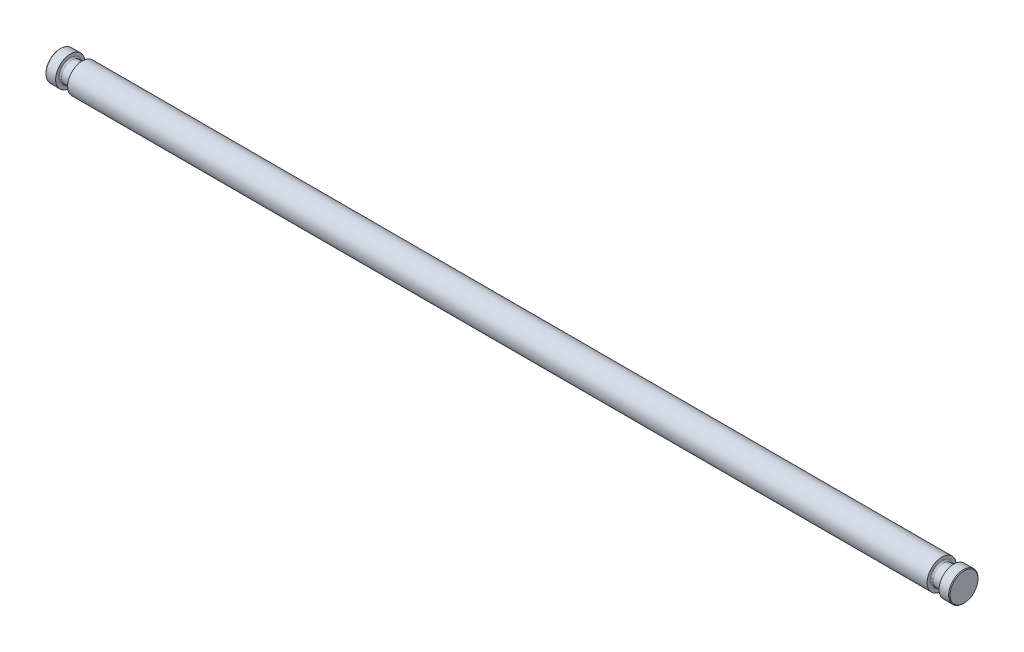
ISO-10303-21;
HEADER;
FILE_DESCRIPTION(('STEP AP214'),'2;1');
FILE_NAME('part.step','',(''),(''),'','','');
FILE_SCHEMA(('AUTOMOTIVE_DESIGN { 1 0 10303 214 1 1 1 1 }'));
ENDSEC;
DATA;
#1=APPLICATION_CONTEXT('core data for automotive mechanical design processes');
#2=APPLICATION_PROTOCOL_DEFINITION('international standard','automotive_design',2000,#1);
#3=PRODUCT_CONTEXT('',#1,'mechanical');
#4=PRODUCT('Part','Part','',(#3));
#5=PRODUCT_RELATED_PRODUCT_CATEGORY('part','',(#4));
#6=PRODUCT_DEFINITION_FORMATION('','',#4);
#7=PRODUCT_DEFINITION_CONTEXT('part definition',#1,'design');
#8=PRODUCT_DEFINITION('design','',#6,#7);
#9=PRODUCT_DEFINITION_SHAPE('','',#8);
#10=(LENGTH_UNIT() NAMED_UNIT(*) SI_UNIT(.MILLI.,.METRE.));
#11=(NAMED_UNIT(*) PLANE_ANGLE_UNIT() SI_UNIT($,.RADIAN.));
#12=(NAMED_UNIT(*) SI_UNIT($,.STERADIAN.) SOLID_ANGLE_UNIT());
#13=UNCERTAINTY_MEASURE_WITH_UNIT(LENGTH_MEASURE(1.E-05),#10,'distance_accuracy_value','');
#14=(GEOMETRIC_REPRESENTATION_CONTEXT(3) GLOBAL_UNCERTAINTY_ASSIGNED_CONTEXT((#13)) GLOBAL_UNIT_ASSIGNED_CONTEXT((#10,
#11,#12)) REPRESENTATION_CONTEXT('',''));
#15=CARTESIAN_POINT('',(0.,0.,0.));
#16=DIRECTION('',(0.,0.,1.));
#17=DIRECTION('',(1.,0.,0.));
#18=AXIS2_PLACEMENT_3D('',#15,#16,#17);
#19=CARTESIAN_POINT('',(-976.376,0.,0.));
#20=DIRECTION('',(1.,0.,0.));
#21=DIRECTION('',(0.,0.,-1.));
#22=AXIS2_PLACEMENT_3D('',#19,#20,#21);
#23=PLANE('',#22);
#24=CARTESIAN_POINT('',(-976.376,0.,0.));
#25=DIRECTION('',(1.,0.,0.));
#26=DIRECTION('',(0.,0.,-1.));
#27=AXIS2_PLACEMENT_3D('',#24,#25,#26);
#28=CIRCLE('',#27,30.20695);
#29=CARTESIAN_POINT('',(-976.376,0.,-30.20695));
#30=VERTEX_POINT('',#29);
#31=EDGE_CURVE('E56',#30,#30,#28,.F.);
#32=ORIENTED_EDGE('',*,*,#31,.T.);
#33=EDGE_LOOP('',(#32));
#34=FACE_BOUND('',#33,.T.);
#35=ADVANCED_FACE('F47',(#34),#23,.F.);
#36=CARTESIAN_POINT('',(-1001.776,0.,0.));
#37=DIRECTION('',(-1.,0.,0.));
#38=DIRECTION('',(0.,0.,1.));
#39=AXIS2_PLACEMENT_3D('',#36,#37,#38);
#40=CYLINDRICAL_SURFACE('',#39,31.73095);
#41=CARTESIAN_POINT('',(-974.852,0.,0.));
#42=DIRECTION('',(1.,0.,0.));
#43=DIRECTION('',(0.,0.,-1.));
#44=AXIS2_PLACEMENT_3D('',#41,#42,#43);
#45=CIRCLE('',#44,31.73095);
#46=CARTESIAN_POINT('',(-974.852,0.,-31.73095));
#47=VERTEX_POINT('',#46);
#48=EDGE_CURVE('E11',#47,#47,#45,.T.);
#49=ORIENTED_EDGE('',*,*,#48,.T.);
#50=EDGE_LOOP('',(#49));
#51=FACE_BOUND('',#50,.T.);
#52=CARTESIAN_POINT('',(-954.024,0.,0.));
#53=DIRECTION('',(-1.,0.,0.));
#54=DIRECTION('',(0.,0.,1.));
#55=AXIS2_PLACEMENT_3D('',#52,#53,#54);
#56=CIRCLE('',#55,31.73095);
#57=CARTESIAN_POINT('',(-954.024,0.,31.73095));
#58=VERTEX_POINT('',#57);
#59=EDGE_CURVE('E165',#58,#58,#56,.T.);
#60=ORIENTED_EDGE('',*,*,#59,.T.);
#61=EDGE_LOOP('',(#60));
#62=FACE_BOUND('',#61,.T.);
#63=ADVANCED_FACE('F272',(#51,#62),#40,.T.);
#64=CARTESIAN_POINT('',(-954.024,0.,-31.73095));
#65=DIRECTION('',(-1.,0.,0.));
#66=DIRECTION('',(0.,0.,1.));
#67=AXIS2_PLACEMENT_3D('',#64,#65,#66);
#68=PLANE('',#67);
#69=CARTESIAN_POINT('',(-954.024,0.,0.));
#70=DIRECTION('',(-1.,0.,0.));
#71=DIRECTION('',(0.,0.,1.));
#72=AXIS2_PLACEMENT_3D('',#69,#70,#71);
#73=CIRCLE('',#72,25.1968);
#74=CARTESIAN_POINT('',(-954.024,0.,25.1968));
#75=VERTEX_POINT('',#74);
#76=EDGE_CURVE('E286',#75,#75,#73,.T.);
#77=ORIENTED_EDGE('',*,*,#76,.T.);
#78=EDGE_LOOP('',(#77));
#79=FACE_BOUND('',#78,.T.);
#80=ORIENTED_EDGE('',*,*,#59,.F.);
#81=EDGE_LOOP('',(#80));
#82=FACE_BOUND('',#81,.T.);
#83=ADVANCED_FACE('F277',(#79,#82),#68,.F.);
#84=CARTESIAN_POINT('',(-1001.776,0.,0.));
#85=DIRECTION('',(-1.,0.,0.));
#86=DIRECTION('',(0.,0.,1.));
#87=AXIS2_PLACEMENT_3D('',#84,#85,#86);
#88=CYLINDRICAL_SURFACE('',#87,22.0218);
#89=CARTESIAN_POINT('',(-931.3926,0.,0.));
#90=DIRECTION('',(1.,0.,0.));
#91=DIRECTION('',(0.,0.,-1.));
#92=AXIS2_PLACEMENT_3D('',#89,#90,#91);
#93=CIRCLE('',#92,22.0218);
#94=CARTESIAN_POINT('',(-931.3926,-4.73984055331991,-21.5056640625));
#95=VERTEX_POINT('',#94);
#96=CARTESIAN_POINT('',(-931.3926,4.73984055331991,-21.5056640625));
#97=VERTEX_POINT('',#96);
#98=EDGE_CURVE('E330',#95,#97,#93,.F.);
#99=ORIENTED_EDGE('',*,*,#98,.T.);
#100=CARTESIAN_POINT('',(-931.302168545165,7.0934113504588,-20.8480980104465));
#101=CARTESIAN_POINT('',(-927.325479582766,6.79762705313636,-20.9487364327555));
#102=CARTESIAN_POINT('',(-928.2176,8.11610618183982,-24.60625));
#103=CARTESIAN_POINT('',(-931.326015362405,6.84109456346153,-20.9339576614));
#104=CARTESIAN_POINT('',(-927.461669079575,6.60732607007663,-21.009743123732));
#105=CARTESIAN_POINT('',(-928.2176,7.82741154201371,-24.60625));
#106=CARTESIAN_POINT('',(-931.343871664976,6.58690615530817,-21.0153222855975));
#107=CARTESIAN_POINT('',(-927.584403184445,6.39979844165955,-21.0735708201359));
#108=CARTESIAN_POINT('',(-928.2176,7.53657543950401,-24.60625));
#109=CARTESIAN_POINT('',(-931.370400435449,6.07550320461208,-21.1688227250801));
#110=CARTESIAN_POINT('',(-927.801875131533,5.96518510588239,-21.1999148046582));
#111=CARTESIAN_POINT('',(-928.2176,6.9514408062244,-24.60625));
#112=CARTESIAN_POINT('',(-931.379076866786,5.81829001656714,-21.2409625113773));
#113=CARTESIAN_POINT('',(-927.897904115642,5.7377728455278,-21.2627348707741));
#114=CARTESIAN_POINT('',(-928.2176,6.65714382523742,-24.60625));
#115=CARTESIAN_POINT('',(-931.390054482062,5.3015410671208,-21.3757954319522));
#116=CARTESIAN_POINT('',(-928.067262479518,5.26947819522838,-21.3834170114611));
#117=CARTESIAN_POINT('',(-928.2176,6.06589243209326,-24.60625));
#118=CARTESIAN_POINT('',(-931.392360728298,5.04200731449822,-21.4384960299311));
#119=CARTESIAN_POINT('',(-928.141484808813,5.02804627651098,-21.4416329448054));
#120=CARTESIAN_POINT('',(-928.2176,5.76894031833128,-24.60625));
#121=CARTESIAN_POINT('',(-931.392804349193,4.52080409437932,-21.5544259330734));
#122=CARTESIAN_POINT('',(-928.271759109345,4.53532481459367,-21.5511651693134));
#123=CARTESIAN_POINT('',(-928.2176,5.17259245860819,-24.60625));
#124=CARTESIAN_POINT('',(-931.390941247477,4.25913438623955,-21.6076541552057));
#125=CARTESIAN_POINT('',(-928.328406199143,4.28335185145398,-21.6028147194452));
#126=CARTESIAN_POINT('',(-928.2176,4.87319643730879,-24.60625));
#127=CARTESIAN_POINT('',(-931.384985322473,3.73976451533267,-21.7035031921574));
#128=CARTESIAN_POINT('',(-928.425868770875,3.77782883007086,-21.6968347552189));
#129=CARTESIAN_POINT('',(-928.2176,4.27894625053387,-24.60625));
#130=CARTESIAN_POINT('',(-931.380941848489,3.48210170967608,-21.7463294355167));
#131=CARTESIAN_POINT('',(-928.467368075008,3.52381374961252,-21.7396442147542));
#132=CARTESIAN_POINT('',(-928.2176,3.98413482814237,-24.60625));
#133=CARTESIAN_POINT('',(-931.372104926311,2.96542533269023,-21.8227891692697));
#134=CARTESIAN_POINT('',(-928.538718294937,3.0109955143445,-21.8165516345209));
#135=CARTESIAN_POINT('',(-928.2176,3.39296647062047,-24.60625));
#136=CARTESIAN_POINT('',(-931.367311476159,2.70641175783558,-21.8564226356588));
#137=CARTESIAN_POINT('',(-928.568823831129,2.75146036628461,-21.8508763558737));
#138=CARTESIAN_POINT('',(-928.2176,3.09660953145639,-24.60625));
#139=CARTESIAN_POINT('',(-931.358137204876,2.1873116520597,-21.9144600621862));
#140=CARTESIAN_POINT('',(-928.619262612525,2.22916840751457,-21.910285323166));
#141=CARTESIAN_POINT('',(-928.2176,2.50266800327961,-24.60625));
#142=CARTESIAN_POINT('',(-931.35375643851,1.92722498350097,-21.9388627986577));
#143=CARTESIAN_POINT('',(-928.639760282131,1.96565894501397,-21.9355425849691));
#144=CARTESIAN_POINT('',(-928.2176,2.20508325678549,-24.60625));
#145=CARTESIAN_POINT('',(-931.346271469181,1.40635472874093,-21.9783997214769));
#146=CARTESIAN_POINT('',(-928.672307288843,1.43684796553149,-21.9764854501547));
#147=CARTESIAN_POINT('',(-928.2176,1.6091163678327,-24.60625));
#148=CARTESIAN_POINT('',(-931.343167167534,1.14557119798374,-21.9935346243675));
#149=CARTESIAN_POINT('',(-928.684457328576,1.17078320061494,-21.992291104408));
#150=CARTESIAN_POINT('',(-928.2176,1.31073428881182,-24.60625));
#151=CARTESIAN_POINT('',(-931.338568876232,0.597745122298998,-22.0155578311015));
#152=CARTESIAN_POINT('',(-928.70196493395,0.611772348818532,-22.0152458065755));
#153=CARTESIAN_POINT('',(-928.2176,0.683925214902679,-24.60625));
#154=CARTESIAN_POINT('',(-931.337265000712,0.310661934074089,-22.0214800302525));
#155=CARTESIAN_POINT('',(-928.706594469351,0.317700164865953,-22.0214652288295));
#156=CARTESIAN_POINT('',(-928.2176,0.355451716956748,-24.60625));
#157=CARTESIAN_POINT('',(-931.337131340711,-0.263517373505815,-22.0220947378159));
#158=CARTESIAN_POINT('',(-928.70707603175,-0.269461586696717,-22.0221083674974));
#159=CARTESIAN_POINT('',(-928.2176,-0.301510074414962,-24.60625));
#160=CARTESIAN_POINT('',(-931.338301573562,-0.550613492937301,-22.0167871675673));
#161=CARTESIAN_POINT('',(-928.702929677725,-0.563576700750445,-22.0165342525774));
#162=CARTESIAN_POINT('',(-928.2176,-0.629998367928262,-24.60625));
#163=CARTESIAN_POINT('',(-931.342880483847,-1.12440887563574,-21.9949499150181));
#164=CARTESIAN_POINT('',(-928.685593489326,-1.14930436202,-21.9937611636677));
#165=CARTESIAN_POINT('',(-928.2176,-1.28652088192694,-24.60625));
#166=CARTESIAN_POINT('',(-931.346289506457,-1.41110807087353,-21.9784185022212));
#167=CARTESIAN_POINT('',(-928.672340770409,-1.44193949015487,-21.976480495112));
#168=CARTESIAN_POINT('',(-928.2176,-1.61455502457503,-24.60625));
#169=CARTESIAN_POINT('',(-931.354622891049,-1.98362369066085,-21.9341593909891));
#170=CARTESIAN_POINT('',(-928.635841048012,-2.02302289076874,-21.930664986805));
#171=CARTESIAN_POINT('',(-928.2176,-2.26961326543894,-24.60625));
#172=CARTESIAN_POINT('',(-931.359547261486,-2.26944011027595,-21.9064316300838));
#173=CARTESIAN_POINT('',(-928.612458101082,-2.31248502869973,-21.901968601197));
#174=CARTESIAN_POINT('',(-928.2176,-2.59663735800892,-24.60625));
#175=CARTESIAN_POINT('',(-931.369852346857,-2.84659151800495,-21.8390249160126));
#176=CARTESIAN_POINT('',(-928.5533445775,-2.89234586040453,-21.8330971099791));
#177=CARTESIAN_POINT('',(-928.2176,-3.25699975301144,-24.60625));
#178=CARTESIAN_POINT('',(-931.37524116245,-3.13789488487916,-21.7990758369104));
#179=CARTESIAN_POINT('',(-928.517090684263,-3.1835820701281,-21.7924162153009));
#180=CARTESIAN_POINT('',(-928.2176,-3.59030187520202,-24.60625));
#181=CARTESIAN_POINT('',(-931.384620675002,-3.7186728563263,-21.7075464149925));
#182=CARTESIAN_POINT('',(-928.429838575036,-3.75741697043674,-21.7008915641428));
#183=CARTESIAN_POINT('',(-928.2176,-4.25481369489701,-24.60625));
#184=CARTESIAN_POINT('',(-931.388611433069,-4.00814754028521,-21.655966580703));
#185=CARTESIAN_POINT('',(-928.378436643179,-4.04105021884703,-21.649705706119));
#186=CARTESIAN_POINT('',(-928.2176,-4.58602348323289,-24.60625));
#187=CARTESIAN_POINT('',(-931.393025656663,-4.58482870659809,-21.5412493039044));
#188=CARTESIAN_POINT('',(-928.257423622809,-4.59680738394717,-21.5385765132356));
#189=CARTESIAN_POINT('',(-928.2176,-5.24584783961398,-24.60625));
#190=CARTESIAN_POINT('',(-931.393449176168,-4.87203522320755,-21.4781120362936));
#191=CARTESIAN_POINT('',(-928.187184670805,-4.86990124252234,-21.4782167917669));
#192=CARTESIAN_POINT('',(-928.2176,-5.57446244685347,-24.60625));
#193=CARTESIAN_POINT('',(-931.387917026851,-5.44369487273694,-21.3403934675186));
#194=CARTESIAN_POINT('',(-928.024138529816,-5.40043093192537,-21.3512362365699));
#195=CARTESIAN_POINT('',(-928.2176,-6.22854130767609,-24.60625));
#196=CARTESIAN_POINT('',(-931.38196011804,-5.72814745960922,-21.2658099442758));
#197=CARTESIAN_POINT('',(-927.930368152435,-5.65870868577164,-21.2841563844831));
#198=CARTESIAN_POINT('',(-928.2176,-6.55400493648497,-24.60625));
#199=CARTESIAN_POINT('',(-931.371406074218,-6.01092228922153,-21.1855726491624));
#200=CARTESIAN_POINT('',(-927.823932633229,-5.90274740007385,-21.2162648028786));
#201=CARTESIAN_POINT('',(-928.2176,-6.87754891684863,-24.60625));
#202=(BOUNDED_SURFACE() B_SPLINE_SURFACE(3,2,((#100,#101,#102),(#103,#104,#105),(#106,#107,
#108),(#109,#110,#111),(#112,#113,#114),(#115,#116,#117),(#118,#119,#120),(#121,#122,#123),
(#124,#125,#126),(#127,#128,#129),(#130,#131,#132),(#133,#134,#135),(#136,#137,#138),(#139,#140,
#141),(#142,#143,#144),(#145,#146,#147),(#148,#149,#150),(#151,#152,#153),(#154,#155,#156),
(#157,#158,#159),(#160,#161,#162),(#163,#164,#165),(#166,#167,#168),(#169,#170,#171),(#172,#173,
#174),(#175,#176,#177),(#178,#179,#180),(#181,#182,#183),(#184,#185,#186),(#187,#188,#189),
(#190,#191,#192),(#193,#194,#195),(#196,#197,#198),(#199,#200,#201)),.UNSPECIFIED.,.F.,.F.,
.F.) B_SPLINE_SURFACE_WITH_KNOTS((4,2,2,2,2,2,2,2,2,2,2,2,2,2,2,2,4),(3,3),(0.,
0.917399633067852,1.83440301448294,2.75067745614845,3.6670565935221,4.56351578860642,
5.45997732454791,6.3565576578147,7.25306866317823,8.23844222107213,9.22382268120847,
10.2093551021839,11.1948930220193,12.2040159836093,13.2130948323351,14.2221584119755,
15.2314181310121),(0.,1.),
.UNSPECIFIED.) GEOMETRIC_REPRESENTATION_ITEM() RATIONAL_B_SPLINE_SURFACE(((1.,0.622760993792926,
1.),(1.,0.634142441155377,1.),(1.,0.644774206829937,1.),(1.,0.664612243268272,1.),(1.,
0.673819127761376,1.),(1.,0.690884181680319,1.),(1.,0.69874341740227,1.),(1.,0.713179102364482,
1.),(1.,0.719755404927884,1.),(1.,0.731538040371441,1.),(1.,0.736771045718675,1.),(1.,
0.746079440390344,1.),(1.,0.750154826691947,1.),(1.,0.757169273148121,1.),(1.,0.76010818264741,
1.),(1.,0.764862396540268,1.),(1.,0.766677787798815,1.),(1.,0.769317917664967,1.),(1.,
0.770026626397274,1.),(1.,0.770100217096104,1.),(1.,0.769465089649494,1.),(1.,0.766847619995479,
1.),(1.,0.764865070041919,1.),(1.,0.75954214753386,1.),(1.,0.756201767403339,1.),(1.,
0.748047922913952,1.),(1.,0.743201119009658,1.),(1.,0.732032116670082,1.),(1.,0.72570998273955,
1.),(1.,0.711544723842197,1.),(1.,0.703701621892014,1.),(1.,0.686422583543893,1.),(1.,
0.676986337830889,1.),(1.,0.666719133165567,1.))) REPRESENTATION_ITEM('') SURFACE());
#203=CARTESIAN_POINT('',(-931.302168545165,7.0934113504588,-20.8480980104465));
#204=CARTESIAN_POINT('',(-931.326015362405,6.84109456346153,-20.9339576614));
#205=CARTESIAN_POINT('',(-931.343871664976,6.58690615530817,-21.0153222855975));
#206=CARTESIAN_POINT('',(-931.370400435449,6.07550320461208,-21.1688227250801));
#207=CARTESIAN_POINT('',(-931.379076866786,5.81829001656714,-21.2409625113773));
#208=CARTESIAN_POINT('',(-931.390054482062,5.30154106712079,-21.3757954319522));
#209=CARTESIAN_POINT('',(-931.392360728298,5.04200731449822,-21.4384960299311));
#210=CARTESIAN_POINT('',(-931.392804349193,4.52080409437932,-21.5544259330734));
#211=CARTESIAN_POINT('',(-931.390941247477,4.25913438623955,-21.6076541552057));
#212=CARTESIAN_POINT('',(-931.384985322473,3.73976451533267,-21.7035031921574));
#213=CARTESIAN_POINT('',(-931.380941848489,3.48210170967608,-21.7463294355167));
#214=CARTESIAN_POINT('',(-931.372104926311,2.96542533269023,-21.8227891692697));
#215=CARTESIAN_POINT('',(-931.367311476159,2.70641175783558,-21.8564226356588));
#216=CARTESIAN_POINT('',(-931.358137204876,2.1873116520597,-21.9144600621862));
#217=CARTESIAN_POINT('',(-931.35375643851,1.92722498350097,-21.9388627986577));
#218=CARTESIAN_POINT('',(-931.346271469181,1.40635472874093,-21.9783997214769));
#219=CARTESIAN_POINT('',(-931.343167167534,1.14557119798374,-21.9935346243675));
#220=CARTESIAN_POINT('',(-931.338568876232,0.597745122298998,-22.0155578311015));
#221=CARTESIAN_POINT('',(-931.337265000712,0.310661934074089,-22.0214800302525));
#222=CARTESIAN_POINT('',(-931.337131340711,-0.263517373505815,-22.0220947378159));
#223=CARTESIAN_POINT('',(-931.338301573562,-0.550613492937301,-22.0167871675673));
#224=CARTESIAN_POINT('',(-931.342880483847,-1.12440887563574,-21.9949499150181));
#225=CARTESIAN_POINT('',(-931.346289506457,-1.41110807087353,-21.9784185022212));
#226=CARTESIAN_POINT('',(-931.354622891049,-1.98362369066085,-21.9341593909891));
#227=CARTESIAN_POINT('',(-931.359547261486,-2.26944011027595,-21.9064316300838));
#228=CARTESIAN_POINT('',(-931.369852346857,-2.84659151800495,-21.8390249160126));
#229=CARTESIAN_POINT('',(-931.37524116245,-3.13789488487916,-21.7990758369104));
#230=CARTESIAN_POINT('',(-931.384620675002,-3.7186728563263,-21.7075464149925));
#231=CARTESIAN_POINT('',(-931.388611433069,-4.00814754028521,-21.655966580703));
#232=CARTESIAN_POINT('',(-931.393025656663,-4.58482870659809,-21.5412493039044));
#233=CARTESIAN_POINT('',(-931.393449176168,-4.87203522320755,-21.4781120362936));
#234=CARTESIAN_POINT('',(-931.387917026851,-5.44369487273694,-21.3403934675186));
#235=CARTESIAN_POINT('',(-931.38196011804,-5.72814745960922,-21.2658099442758));
#236=CARTESIAN_POINT('',(-931.371406074218,-6.01092228922153,-21.1855726491624));
#237=B_SPLINE_CURVE_WITH_KNOTS('',3,(#203,#204,#205,#206,#207,#208,#209,#210,#211,#212,#213,
#214,#215,#216,#217,#218,#219,#220,#221,#222,#223,#224,#225,#226,#227,#228,#229,#230,#231,#232,
#233,#234,#235,#236),.UNSPECIFIED.,.F.,.F.,(4,2,2,2,2,2,2,2,2,2,2,2,2,2,2,2,4),(0.,
0.917399633067852,1.83440301448294,2.75067745614845,3.6670565935221,4.56351578860642,
5.45997732454791,6.3565576578147,7.25306866317823,8.23844222107213,9.22382268120847,
10.2093551021839,11.1948930220193,12.2040159836093,13.2130948323351,14.2221584119755,
15.2314181310121),.UNSPECIFIED.);
#238=EDGE_CURVE('E293',#97,#95,#237,.T.);
#239=ORIENTED_EDGE('',*,*,#238,.T.);
#240=EDGE_LOOP('',(#99,#239));
#241=FACE_BOUND('',#240,.T.);
#242=CARTESIAN_POINT('',(-950.849,0.,0.));
#243=DIRECTION('',(-1.,0.,0.));
#244=DIRECTION('',(0.,0.,1.));
#245=AXIS2_PLACEMENT_3D('',#242,#243,#244);
#246=CIRCLE('',#245,22.0218);
#247=CARTESIAN_POINT('',(-950.849,0.,22.0218));
#248=VERTEX_POINT('',#247);
#249=EDGE_CURVE('E327',#248,#248,#246,.F.);
#250=ORIENTED_EDGE('',*,*,#249,.T.);
#251=EDGE_LOOP('',(#250));
#252=FACE_BOUND('',#251,.T.);
#253=ADVANCED_FACE('F237',(#241,#252),#88,.T.);
#254=CARTESIAN_POINT('',(-928.2176,0.,-22.0218));
#255=DIRECTION('',(1.,0.,0.));
#256=DIRECTION('',(0.,0.,-1.));
#257=AXIS2_PLACEMENT_3D('',#254,#255,#256);
#258=PLANE('',#257);
#259=DIRECTION('',(0.,1.,0.));
#260=VECTOR('',#259,1.);
#261=CARTESIAN_POINT('',(-928.2176,0.,-24.60625));
#262=LINE('',#261,#260);
#263=CARTESIAN_POINT('',(-928.2176,5.42320856850444,-24.60625));
#264=VERTEX_POINT('',#263);
#265=CARTESIAN_POINT('',(-928.2176,6.35,-24.60625));
#266=VERTEX_POINT('',#265);
#267=EDGE_CURVE('E140',#264,#266,#262,.T.);
#268=ORIENTED_EDGE('',*,*,#267,.F.);
#269=CARTESIAN_POINT('',(-928.2176,0.,0.));
#270=DIRECTION('',(1.,0.,0.));
#271=DIRECTION('',(0.,0.,-1.));
#272=AXIS2_PLACEMENT_3D('',#269,#270,#271);
#273=CIRCLE('',#272,25.1968);
#274=CARTESIAN_POINT('',(-928.2176,-5.42320856850444,-24.60625));
#275=VERTEX_POINT('',#274);
#276=EDGE_CURVE('E70',#264,#275,#273,.T.);
#277=ORIENTED_EDGE('',*,*,#276,.T.);
#278=CARTESIAN_POINT('',(-928.2176,-6.35,-24.60625));
#279=VERTEX_POINT('',#278);
#280=EDGE_CURVE('E130',#279,#275,#262,.T.);
#281=ORIENTED_EDGE('',*,*,#280,.F.);
#282=DIRECTION('',(0.,0.,-1.));
#283=VECTOR('',#282,1.);
#284=CARTESIAN_POINT('',(-928.2176,-6.35,-22.0218));
#285=LINE('',#284,#283);
#286=CARTESIAN_POINT('',(-928.2176,-6.35,-31.0890766653257));
#287=VERTEX_POINT('',#286);
#288=EDGE_CURVE('E116',#279,#287,#285,.T.);
#289=ORIENTED_EDGE('',*,*,#288,.T.);
#290=CARTESIAN_POINT('',(-928.2176,0.,0.));
#291=DIRECTION('',(-1.,0.,0.));
#292=DIRECTION('',(0.,0.,1.));
#293=AXIS2_PLACEMENT_3D('',#290,#291,#292);
#294=CIRCLE('',#293,31.73095);
#295=CARTESIAN_POINT('',(-928.2176,6.35,-31.0890766653257));
#296=VERTEX_POINT('',#295);
#297=EDGE_CURVE('E154',#287,#296,#294,.T.);
#298=ORIENTED_EDGE('',*,*,#297,.T.);
#299=DIRECTION('',(0.,0.,1.));
#300=VECTOR('',#299,1.);
#301=CARTESIAN_POINT('',(-928.2176,6.35,-22.0218));
#302=LINE('',#301,#300);
#303=EDGE_CURVE('E148',#296,#266,#302,.T.);
#304=ORIENTED_EDGE('',*,*,#303,.T.);
#305=EDGE_LOOP('',(#268,#277,#281,#289,#298,#304));
#306=FACE_BOUND('',#305,.T.);
#307=ADVANCED_FACE('F137',(#306),#258,.F.);
#308=CARTESIAN_POINT('',(-1001.776,0.,0.));
#309=DIRECTION('',(-1.,0.,0.));
#310=DIRECTION('',(0.,0.,1.));
#311=AXIS2_PLACEMENT_3D('',#308,#309,#310);
#312=CYLINDRICAL_SURFACE('',#311,31.73095);
#313=CARTESIAN_POINT('',(928.3446,0.,0.));
#314=DIRECTION('',(-1.,0.,0.));
#315=DIRECTION('',(0.,0.,1.));
#316=AXIS2_PLACEMENT_3D('',#313,#314,#315);
#317=CIRCLE('',#316,31.73095);
#318=CARTESIAN_POINT('',(928.3446,-6.35,-31.0890766653257));
#319=VERTEX_POINT('',#318);
#320=CARTESIAN_POINT('',(928.3446,6.35,-31.0890766653257));
#321=VERTEX_POINT('',#320);
#322=EDGE_CURVE('E158',#319,#321,#317,.T.);
#323=ORIENTED_EDGE('',*,*,#322,.T.);
#324=DIRECTION('',(-1.,0.,0.));
#325=VECTOR('',#324,1.);
#326=CARTESIAN_POINT('',(-1001.776,6.35,-31.0890766653257));
#327=LINE('',#326,#325);
#328=EDGE_CURVE('E125',#321,#296,#327,.T.);
#329=ORIENTED_EDGE('',*,*,#328,.T.);
#330=ORIENTED_EDGE('',*,*,#297,.F.);
#331=DIRECTION('',(-1.,0.,0.));
#332=VECTOR('',#331,1.);
#333=CARTESIAN_POINT('',(-1001.776,-6.35,-31.0890766653257));
#334=LINE('',#333,#332);
#335=EDGE_CURVE('E122',#287,#319,#334,.F.);
#336=ORIENTED_EDGE('',*,*,#335,.T.);
#337=EDGE_LOOP('',(#323,#329,#330,#336));
#338=FACE_BOUND('',#337,.T.);
#339=ADVANCED_FACE('F316',(#338),#312,.T.);
#340=CARTESIAN_POINT('',(928.3446,0.,-31.73095));
#341=DIRECTION('',(-1.,0.,0.));
#342=DIRECTION('',(0.,0.,1.));
#343=AXIS2_PLACEMENT_3D('',#340,#341,#342);
#344=PLANE('',#343);
#345=DIRECTION('',(0.,-1.,0.));
#346=VECTOR('',#345,1.);
#347=CARTESIAN_POINT('',(928.3446,0.,-24.60625));
#348=LINE('',#347,#346);
#349=CARTESIAN_POINT('',(928.3446,-5.42320856850444,-24.60625));
#350=VERTEX_POINT('',#349);
#351=CARTESIAN_POINT('',(928.3446,-6.35,-24.60625));
#352=VERTEX_POINT('',#351);
#353=EDGE_CURVE('E133',#350,#352,#348,.T.);
#354=ORIENTED_EDGE('',*,*,#353,.F.);
#355=CARTESIAN_POINT('',(928.3446,0.,0.));
#356=DIRECTION('',(-1.,0.,0.));
#357=DIRECTION('',(0.,0.,1.));
#358=AXIS2_PLACEMENT_3D('',#355,#356,#357);
#359=CIRCLE('',#358,25.1968);
#360=CARTESIAN_POINT('',(928.3446,5.42320856850444,-24.60625));
#361=VERTEX_POINT('',#360);
#362=EDGE_CURVE('E323',#350,#361,#359,.T.);
#363=ORIENTED_EDGE('',*,*,#362,.T.);
#364=CARTESIAN_POINT('',(928.3446,6.35,-24.60625));
#365=VERTEX_POINT('',#364);
#366=EDGE_CURVE('E168',#365,#361,#348,.T.);
#367=ORIENTED_EDGE('',*,*,#366,.F.);
#368=DIRECTION('',(0.,0.,-1.));
#369=VECTOR('',#368,1.);
#370=CARTESIAN_POINT('',(928.3446,6.35,-31.73095));
#371=LINE('',#370,#369);
#372=EDGE_CURVE('E151',#365,#321,#371,.T.);
#373=ORIENTED_EDGE('',*,*,#372,.T.);
#374=ORIENTED_EDGE('',*,*,#322,.F.);
#375=DIRECTION('',(0.,0.,1.));
#376=VECTOR('',#375,1.);
#377=CARTESIAN_POINT('',(928.3446,-6.35,-31.73095));
#378=LINE('',#377,#376);
#379=EDGE_CURVE('E170',#319,#352,#378,.T.);
#380=ORIENTED_EDGE('',*,*,#379,.T.);
#381=EDGE_LOOP('',(#354,#363,#367,#373,#374,#380));
#382=FACE_BOUND('',#381,.T.);
#383=ADVANCED_FACE('F308',(#382),#344,.F.);
#384=CARTESIAN_POINT('',(-1001.776,0.,0.));
#385=DIRECTION('',(-1.,0.,0.));
#386=DIRECTION('',(0.,0.,1.));
#387=AXIS2_PLACEMENT_3D('',#384,#385,#386);
#388=CYLINDRICAL_SURFACE('',#387,22.0218);
#389=CARTESIAN_POINT('',(950.976,0.,0.));
#390=DIRECTION('',(1.,0.,0.));
#391=DIRECTION('',(0.,0.,-1.));
#392=AXIS2_PLACEMENT_3D('',#389,#390,#391);
#393=CIRCLE('',#392,22.0218);
#394=CARTESIAN_POINT('',(950.976,0.,-22.0218));
#395=VERTEX_POINT('',#394);
#396=EDGE_CURVE('E305',#395,#395,#393,.F.);
#397=ORIENTED_EDGE('',*,*,#396,.T.);
#398=EDGE_LOOP('',(#397));
#399=FACE_BOUND('',#398,.T.);
#400=CARTESIAN_POINT('',(928.3446,8.11610618183982,-24.60625));
#401=CARTESIAN_POINT('',(927.452479582766,6.79762705313636,-20.9487364327555));
#402=CARTESIAN_POINT('',(931.429168545165,7.0934113504588,-20.8480980104465));
#403=CARTESIAN_POINT('',(928.3446,7.82741154201371,-24.60625));
#404=CARTESIAN_POINT('',(927.588669079575,6.60732607007663,-21.009743123732));
#405=CARTESIAN_POINT('',(931.453015362405,6.84109456346153,-20.9339576614));
#406=CARTESIAN_POINT('',(928.3446,7.53657543950401,-24.60625));
#407=CARTESIAN_POINT('',(927.711403184444,6.39979844165956,-21.0735708201359));
#408=CARTESIAN_POINT('',(931.470871664975,6.58690615530817,-21.0153222855975));
#409=CARTESIAN_POINT('',(928.3446,6.95144080622441,-24.60625));
#410=CARTESIAN_POINT('',(927.928875131533,5.9651851058824,-21.1999148046582));
#411=CARTESIAN_POINT('',(931.497400435449,6.07550320461209,-21.1688227250801));
#412=CARTESIAN_POINT('',(928.3446,6.65714382523742,-24.60625));
#413=CARTESIAN_POINT('',(928.024904115642,5.7377728455278,-21.2627348707741));
#414=CARTESIAN_POINT('',(931.506076866786,5.81829001656714,-21.2409625113773));
#415=CARTESIAN_POINT('',(928.3446,6.06589243209326,-24.60625));
#416=CARTESIAN_POINT('',(928.194262479518,5.26947819522839,-21.3834170114611));
#417=CARTESIAN_POINT('',(931.517054482062,5.3015410671208,-21.3757954319522));
#418=CARTESIAN_POINT('',(928.3446,5.76894031833128,-24.60625));
#419=CARTESIAN_POINT('',(928.268484808813,5.02804627651098,-21.4416329448054));
#420=CARTESIAN_POINT('',(931.519360728298,5.04200731449822,-21.4384960299311));
#421=CARTESIAN_POINT('',(928.3446,5.17259245860819,-24.60625));
#422=CARTESIAN_POINT('',(928.398759109345,4.53532481459368,-21.5511651693134));
#423=CARTESIAN_POINT('',(931.519804349193,4.52080409437932,-21.5544259330734));
#424=CARTESIAN_POINT('',(928.3446,4.87319643730879,-24.60625));
#425=CARTESIAN_POINT('',(928.455406199143,4.28335185145398,-21.6028147194452));
#426=CARTESIAN_POINT('',(931.517941247477,4.25913438623955,-21.6076541552057));
#427=CARTESIAN_POINT('',(928.3446,4.27894625053387,-24.60625));
#428=CARTESIAN_POINT('',(928.552868770875,3.77782883007086,-21.6968347552189));
#429=CARTESIAN_POINT('',(931.511985322473,3.73976451533267,-21.7035031921574));
#430=CARTESIAN_POINT('',(928.3446,3.98413482814236,-24.60625));
#431=CARTESIAN_POINT('',(928.594368075008,3.52381374961252,-21.7396442147542));
#432=CARTESIAN_POINT('',(931.507941848489,3.48210170967607,-21.7463294355167));
#433=CARTESIAN_POINT('',(928.3446,3.39296647062046,-24.60625));
#434=CARTESIAN_POINT('',(928.665718294938,3.0109955143445,-21.8165516345209));
#435=CARTESIAN_POINT('',(931.499104926311,2.96542533269022,-21.8227891692697));
#436=CARTESIAN_POINT('',(928.3446,3.09660953145639,-24.60625));
#437=CARTESIAN_POINT('',(928.695823831129,2.75146036628461,-21.8508763558737));
#438=CARTESIAN_POINT('',(931.494311476159,2.70641175783558,-21.8564226356588));
#439=CARTESIAN_POINT('',(928.3446,2.50266800327961,-24.60625));
#440=CARTESIAN_POINT('',(928.746262612524,2.22916840751456,-21.910285323166));
#441=CARTESIAN_POINT('',(931.485137204876,2.18731165205969,-21.9144600621862));
#442=CARTESIAN_POINT('',(928.3446,2.20508325678548,-24.60625));
#443=CARTESIAN_POINT('',(928.766760282131,1.96565894501396,-21.9355425849691));
#444=CARTESIAN_POINT('',(931.48075643851,1.92722498350097,-21.9388627986577));
#445=CARTESIAN_POINT('',(928.3446,1.6091163678327,-24.60625));
#446=CARTESIAN_POINT('',(928.799307288843,1.43684796553149,-21.9764854501547));
#447=CARTESIAN_POINT('',(931.473271469181,1.40635472874093,-21.9783997214769));
#448=CARTESIAN_POINT('',(928.3446,1.31073428881182,-24.60625));
#449=CARTESIAN_POINT('',(928.811457328575,1.17078320061494,-21.992291104408));
#450=CARTESIAN_POINT('',(931.470167167534,1.14557119798373,-21.9935346243675));
#451=CARTESIAN_POINT('',(928.3446,0.683925214902679,-24.60625));
#452=CARTESIAN_POINT('',(928.828964933949,0.611772348818532,-22.0152458065755));
#453=CARTESIAN_POINT('',(931.465568876232,0.597745122298998,-22.0155578311015));
#454=CARTESIAN_POINT('',(928.3446,0.355451716956747,-24.60625));
#455=CARTESIAN_POINT('',(928.83359446935,0.317700164865953,-22.0214652288295));
#456=CARTESIAN_POINT('',(931.464265000712,0.310661934074088,-22.0214800302525));
#457=CARTESIAN_POINT('',(928.3446,-0.301510074414962,-24.60625));
#458=CARTESIAN_POINT('',(928.83407603175,-0.269461586696717,-22.0221083674974));
#459=CARTESIAN_POINT('',(931.464131340711,-0.263517373505814,-22.0220947378159));
#460=CARTESIAN_POINT('',(928.3446,-0.62999836792826,-24.60625));
#461=CARTESIAN_POINT('',(928.829929677726,-0.563576700750444,-22.0165342525774));
#462=CARTESIAN_POINT('',(931.465301573561,-0.5506134929373,-22.0167871675673));
#463=CARTESIAN_POINT('',(928.3446,-1.28652088192694,-24.60625));
#464=CARTESIAN_POINT('',(928.812593489326,-1.14930436202,-21.9937611636677));
#465=CARTESIAN_POINT('',(931.469880483847,-1.12440887563574,-21.9949499150181));
#466=CARTESIAN_POINT('',(928.3446,-1.61455502457503,-24.60625));
#467=CARTESIAN_POINT('',(928.799340770409,-1.44193949015486,-21.976480495112));
#468=CARTESIAN_POINT('',(931.473289506457,-1.41110807087353,-21.9784185022212));
#469=CARTESIAN_POINT('',(928.3446,-2.26961326543894,-24.60625));
#470=CARTESIAN_POINT('',(928.762841048012,-2.02302289076874,-21.930664986805));
#471=CARTESIAN_POINT('',(931.481622891049,-1.98362369066085,-21.9341593909891));
#472=CARTESIAN_POINT('',(928.3446,-2.59663735800892,-24.60625));
#473=CARTESIAN_POINT('',(928.739458101082,-2.31248502869973,-21.901968601197));
#474=CARTESIAN_POINT('',(931.486547261486,-2.26944011027595,-21.9064316300838));
#475=CARTESIAN_POINT('',(928.3446,-3.25699975301144,-24.60625));
#476=CARTESIAN_POINT('',(928.6803445775,-2.89234586040453,-21.8330971099791));
#477=CARTESIAN_POINT('',(931.496852346857,-2.84659151800495,-21.8390249160126));
#478=CARTESIAN_POINT('',(928.3446,-3.59030187520202,-24.60625));
#479=CARTESIAN_POINT('',(928.644090684262,-3.1835820701281,-21.7924162153009));
#480=CARTESIAN_POINT('',(931.50224116245,-3.13789488487915,-21.7990758369104));
#481=CARTESIAN_POINT('',(928.3446,-4.25481369489701,-24.60625));
#482=CARTESIAN_POINT('',(928.556838575035,-3.75741697043674,-21.7008915641428));
#483=CARTESIAN_POINT('',(931.511620675002,-3.71867285632629,-21.7075464149925));
#484=CARTESIAN_POINT('',(928.3446,-4.58602348323288,-24.60625));
#485=CARTESIAN_POINT('',(928.505436643179,-4.04105021884703,-21.649705706119));
#486=CARTESIAN_POINT('',(931.515611433069,-4.0081475402852,-21.655966580703));
#487=CARTESIAN_POINT('',(928.3446,-5.24584783961397,-24.60625));
#488=CARTESIAN_POINT('',(928.384423622809,-4.59680738394717,-21.5385765132356));
#489=CARTESIAN_POINT('',(931.520025656663,-4.58482870659809,-21.5412493039044));
#490=CARTESIAN_POINT('',(928.3446,-5.57446244685346,-24.60625));
#491=CARTESIAN_POINT('',(928.314184670804,-4.86990124252234,-21.4782167917669));
#492=CARTESIAN_POINT('',(931.520449176168,-4.87203522320754,-21.4781120362936));
#493=CARTESIAN_POINT('',(928.3446,-6.22854130767608,-24.60625));
#494=CARTESIAN_POINT('',(928.151138529816,-5.40043093192537,-21.3512362365699));
#495=CARTESIAN_POINT('',(931.514917026851,-5.44369487273693,-21.3403934675186));
#496=CARTESIAN_POINT('',(928.3446,-6.55400493648497,-24.60625));
#497=CARTESIAN_POINT('',(928.057368152434,-5.65870868577164,-21.2841563844831));
#498=CARTESIAN_POINT('',(931.50896011804,-5.72814745960922,-21.2658099442758));
#499=CARTESIAN_POINT('',(928.3446,-6.87754891684863,-24.60625));
#500=CARTESIAN_POINT('',(927.950932633229,-5.90274740007385,-21.2162648028786));
#501=CARTESIAN_POINT('',(931.498406074218,-6.01092228922153,-21.1855726491624));
#502=(BOUNDED_SURFACE() B_SPLINE_SURFACE(3,2,((#400,#401,#402),(#403,#404,#405),(#406,#407,
#408),(#409,#410,#411),(#412,#413,#414),(#415,#416,#417),(#418,#419,#420),(#421,#422,#423),
(#424,#425,#426),(#427,#428,#429),(#430,#431,#432),(#433,#434,#435),(#436,#437,#438),(#439,#440,
#441),(#442,#443,#444),(#445,#446,#447),(#448,#449,#450),(#451,#452,#453),(#454,#455,#456),
(#457,#458,#459),(#460,#461,#462),(#463,#464,#465),(#466,#467,#468),(#469,#470,#471),(#472,#473,
#474),(#475,#476,#477),(#478,#479,#480),(#481,#482,#483),(#484,#485,#486),(#487,#488,#489),
(#490,#491,#492),(#493,#494,#495),(#496,#497,#498),(#499,#500,#501)),.UNSPECIFIED.,.F.,.F.,
.F.) B_SPLINE_SURFACE_WITH_KNOTS((4,2,2,2,2,2,2,2,2,2,2,2,2,2,2,2,4),(3,3),(0.,
0.917399633067846,1.83440301448293,2.75067745614845,3.6670565935221,4.56351578860642,
5.45997732454791,6.35655765781471,7.25306866317823,8.23844222107213,9.22382268120847,
10.2093551021839,11.1948930220193,12.2040159836093,13.2130948323351,14.2221584119755,
15.2314181310121),(0.,1.),
.UNSPECIFIED.) GEOMETRIC_REPRESENTATION_ITEM() RATIONAL_B_SPLINE_SURFACE(((1.,0.622760993792926,
1.),(1.,0.634142441155377,1.),(1.,0.644774206829937,1.),(1.,0.664612243268272,1.),(1.,
0.673819127761376,1.),(1.,0.690884181680319,1.),(1.,0.69874341740227,1.),(1.,0.713179102364482,
1.),(1.,0.719755404927884,1.),(1.,0.731538040371441,1.),(1.,0.736771045718675,1.),(1.,
0.746079440390344,1.),(1.,0.750154826691947,1.),(1.,0.757169273148121,1.),(1.,0.76010818264741,
1.),(1.,0.764862396540268,1.),(1.,0.766677787798815,1.),(1.,0.769317917664967,1.),(1.,
0.770026626397274,1.),(1.,0.770100217096104,1.),(1.,0.769465089649494,1.),(1.,0.766847619995479,
1.),(1.,0.764865070041919,1.),(1.,0.759542147533861,1.),(1.,0.75620176740334,1.),(1.,
0.748047922913952,1.),(1.,0.743201119009658,1.),(1.,0.732032116670082,1.),(1.,0.72570998273955,
1.),(1.,0.711544723842197,1.),(1.,0.703701621892014,1.),(1.,0.686422583543893,1.),(1.,
0.676986337830889,1.),(1.,0.666719133165567,1.))) REPRESENTATION_ITEM('') SURFACE());
#503=CARTESIAN_POINT('',(931.498406074218,-6.01092228922153,-21.1855726491624));
#504=CARTESIAN_POINT('',(931.50896011804,-5.72814745960922,-21.2658099442758));
#505=CARTESIAN_POINT('',(931.514917026851,-5.44369487273693,-21.3403934675186));
#506=CARTESIAN_POINT('',(931.520449176168,-4.87203522320754,-21.4781120362936));
#507=CARTESIAN_POINT('',(931.520025656663,-4.58482870659809,-21.5412493039044));
#508=CARTESIAN_POINT('',(931.515611433069,-4.0081475402852,-21.655966580703));
#509=CARTESIAN_POINT('',(931.511620675002,-3.71867285632629,-21.7075464149925));
#510=CARTESIAN_POINT('',(931.50224116245,-3.13789488487915,-21.7990758369104));
#511=CARTESIAN_POINT('',(931.496852346857,-2.84659151800495,-21.8390249160126));
#512=CARTESIAN_POINT('',(931.486547261486,-2.26944011027595,-21.9064316300838));
#513=CARTESIAN_POINT('',(931.481622891049,-1.98362369066085,-21.9341593909891));
#514=CARTESIAN_POINT('',(931.473289506457,-1.41110807087353,-21.9784185022212));
#515=CARTESIAN_POINT('',(931.469880483847,-1.12440887563574,-21.9949499150181));
#516=CARTESIAN_POINT('',(931.465301573562,-0.5506134929373,-22.0167871675673));
#517=CARTESIAN_POINT('',(931.464131340711,-0.263517373505815,-22.0220947378159));
#518=CARTESIAN_POINT('',(931.464265000712,0.310661934074088,-22.0214800302525));
#519=CARTESIAN_POINT('',(931.465568876232,0.597745122298999,-22.0155578311015));
#520=CARTESIAN_POINT('',(931.470167167534,1.14557119798374,-21.9935346243675));
#521=CARTESIAN_POINT('',(931.473271469181,1.40635472874093,-21.9783997214769));
#522=CARTESIAN_POINT('',(931.48075643851,1.92722498350097,-21.9388627986577));
#523=CARTESIAN_POINT('',(931.485137204876,2.18731165205969,-21.9144600621862));
#524=CARTESIAN_POINT('',(931.494311476159,2.70641175783558,-21.8564226356588));
#525=CARTESIAN_POINT('',(931.499104926311,2.96542533269022,-21.8227891692697));
#526=CARTESIAN_POINT('',(931.507941848489,3.48210170967607,-21.7463294355167));
#527=CARTESIAN_POINT('',(931.511985322473,3.73976451533267,-21.7035031921574));
#528=CARTESIAN_POINT('',(931.517941247477,4.25913438623955,-21.6076541552057));
#529=CARTESIAN_POINT('',(931.519804349193,4.52080409437932,-21.5544259330734));
#530=CARTESIAN_POINT('',(931.519360728298,5.04200731449822,-21.4384960299311));
#531=CARTESIAN_POINT('',(931.517054482062,5.3015410671208,-21.3757954319522));
#532=CARTESIAN_POINT('',(931.506076866786,5.81829001656714,-21.2409625113773));
#533=CARTESIAN_POINT('',(931.497400435449,6.07550320461209,-21.1688227250801));
#534=CARTESIAN_POINT('',(931.470871664975,6.58690615530817,-21.0153222855975));
#535=CARTESIAN_POINT('',(931.453015362405,6.84109456346153,-20.9339576614));
#536=CARTESIAN_POINT('',(931.429168545165,7.0934113504588,-20.8480980104465));
#537=B_SPLINE_CURVE_WITH_KNOTS('',3,(#503,#504,#505,#506,#507,#508,#509,#510,#511,#512,#513,
#514,#515,#516,#517,#518,#519,#520,#521,#522,#523,#524,#525,#526,#527,#528,#529,#530,#531,#532,
#533,#534,#535,#536),.UNSPECIFIED.,.F.,.F.,(4,2,2,2,2,2,2,2,2,2,2,2,2,2,2,2,4),(0.,
1.00925971903658,2.01832329867695,3.02740214740273,4.03652510899277,5.02206302882813,
6.00759544980359,6.99297590993994,7.97834946783383,8.87486047319736,9.77144080646415,
10.6679023424056,11.56436153749,12.4807406748636,13.3970151165291,14.3140184979442,
15.2314181310121),.UNSPECIFIED.);
#538=CARTESIAN_POINT('',(931.5196,-4.73984055331991,-21.5056640625));
#539=VERTEX_POINT('',#538);
#540=CARTESIAN_POINT('',(931.5196,4.73984055331991,-21.5056640625));
#541=VERTEX_POINT('',#540);
#542=EDGE_CURVE('E174',#539,#541,#537,.T.);
#543=ORIENTED_EDGE('',*,*,#542,.T.);
#544=CARTESIAN_POINT('',(931.5196,0.,0.));
#545=DIRECTION('',(-1.,0.,0.));
#546=DIRECTION('',(0.,0.,1.));
#547=AXIS2_PLACEMENT_3D('',#544,#545,#546);
#548=CIRCLE('',#547,22.0218);
#549=EDGE_CURVE('E183',#541,#539,#548,.F.);
#550=ORIENTED_EDGE('',*,*,#549,.T.);
#551=EDGE_LOOP('',(#543,#550));
#552=FACE_BOUND('',#551,.T.);
#553=ADVANCED_FACE('F185',(#399,#552),#388,.T.);
#554=CARTESIAN_POINT('',(954.151,0.,-22.0218));
#555=DIRECTION('',(1.,0.,0.));
#556=DIRECTION('',(0.,0.,-1.));
#557=AXIS2_PLACEMENT_3D('',#554,#555,#556);
#558=PLANE('',#557);
#559=CARTESIAN_POINT('',(954.151,0.,0.));
#560=DIRECTION('',(1.,0.,0.));
#561=DIRECTION('',(0.,0.,-1.));
#562=AXIS2_PLACEMENT_3D('',#559,#560,#561);
#563=CIRCLE('',#562,25.1968);
#564=CARTESIAN_POINT('',(954.151,0.,-25.1968));
#565=VERTEX_POINT('',#564);
#566=EDGE_CURVE('E321',#565,#565,#563,.T.);
#567=ORIENTED_EDGE('',*,*,#566,.T.);
#568=EDGE_LOOP('',(#567));
#569=FACE_BOUND('',#568,.T.);
#570=CARTESIAN_POINT('',(954.151,0.,0.));
#571=DIRECTION('',(-1.,0.,0.));
#572=DIRECTION('',(0.,0.,1.));
#573=AXIS2_PLACEMENT_3D('',#570,#571,#572);
#574=CIRCLE('',#573,31.73095);
#575=CARTESIAN_POINT('',(954.151,0.,31.73095));
#576=VERTEX_POINT('',#575);
#577=EDGE_CURVE('E155',#576,#576,#574,.T.);
#578=ORIENTED_EDGE('',*,*,#577,.T.);
#579=EDGE_LOOP('',(#578));
#580=FACE_BOUND('',#579,.T.);
#581=ADVANCED_FACE('F307',(#569,#580),#558,.F.);
#582=CARTESIAN_POINT('',(-1001.776,0.,0.));
#583=DIRECTION('',(-1.,0.,0.));
#584=DIRECTION('',(0.,0.,1.));
#585=AXIS2_PLACEMENT_3D('',#582,#583,#584);
#586=CYLINDRICAL_SURFACE('',#585,31.73095);
#587=CARTESIAN_POINT('',(974.852,0.,0.));
#588=DIRECTION('',(-1.,0.,0.));
#589=DIRECTION('',(0.,0.,1.));
#590=AXIS2_PLACEMENT_3D('',#587,#588,#589);
#591=CIRCLE('',#590,31.73095);
#592=CARTESIAN_POINT('',(974.852,0.,31.73095));
#593=VERTEX_POINT('',#592);
#594=EDGE_CURVE('E248',#593,#593,#591,.T.);
#595=ORIENTED_EDGE('',*,*,#594,.T.);
#596=EDGE_LOOP('',(#595));
#597=FACE_BOUND('',#596,.T.);
#598=ORIENTED_EDGE('',*,*,#577,.F.);
#599=EDGE_LOOP('',(#598));
#600=FACE_BOUND('',#599,.T.);
#601=ADVANCED_FACE('F314',(#597,#600),#586,.T.);
#602=CARTESIAN_POINT('',(976.376,0.,-31.73095));
#603=DIRECTION('',(-1.,0.,0.));
#604=DIRECTION('',(0.,0.,1.));
#605=AXIS2_PLACEMENT_3D('',#602,#603,#604);
#606=PLANE('',#605);
#607=CARTESIAN_POINT('',(976.376,0.,0.));
#608=DIRECTION('',(-1.,0.,0.));
#609=DIRECTION('',(0.,0.,1.));
#610=AXIS2_PLACEMENT_3D('',#607,#608,#609);
#611=CIRCLE('',#610,30.2069499999997);
#612=CARTESIAN_POINT('',(976.376,0.,30.2069499999997));
#613=VERTEX_POINT('',#612);
#614=EDGE_CURVE('E282',#613,#613,#611,.F.);
#615=ORIENTED_EDGE('',*,*,#614,.T.);
#616=EDGE_LOOP('',(#615));
#617=FACE_BOUND('',#616,.T.);
#618=ADVANCED_FACE('F368',(#617),#606,.F.);
#619=CARTESIAN_POINT('',(-941.1208,6.35,-88.06815));
#620=DIRECTION('',(0.,1.,0.));
#621=DIRECTION('',(0.,0.,1.));
#622=AXIS2_PLACEMENT_3D('',#619,#620,#621);
#623=PLANE('',#622);
#624=ORIENTED_EDGE('',*,*,#328,.F.);
#625=ORIENTED_EDGE('',*,*,#372,.F.);
#626=DIRECTION('',(-1.,0.,0.));
#627=VECTOR('',#626,1.);
#628=CARTESIAN_POINT('',(-941.1208,6.35,-24.60625));
#629=LINE('',#628,#627);
#630=EDGE_CURVE('E134',#365,#266,#629,.T.);
#631=ORIENTED_EDGE('',*,*,#630,.T.);
#632=ORIENTED_EDGE('',*,*,#303,.F.);
#633=EDGE_LOOP('',(#624,#625,#631,#632));
#634=FACE_BOUND('',#633,.T.);
#635=ADVANCED_FACE('F147',(#634),#623,.F.);
#636=CARTESIAN_POINT('',(-941.1208,-6.35,-88.06815));
#637=DIRECTION('',(0.,-1.,0.));
#638=DIRECTION('',(0.,0.,-1.));
#639=AXIS2_PLACEMENT_3D('',#636,#637,#638);
#640=PLANE('',#639);
#641=DIRECTION('',(1.,0.,0.));
#642=VECTOR('',#641,1.);
#643=CARTESIAN_POINT('',(-941.1208,-6.35,-24.60625));
#644=LINE('',#643,#642);
#645=EDGE_CURVE('E119',#279,#352,#644,.T.);
#646=ORIENTED_EDGE('',*,*,#645,.T.);
#647=ORIENTED_EDGE('',*,*,#379,.F.);
#648=ORIENTED_EDGE('',*,*,#335,.F.);
#649=ORIENTED_EDGE('',*,*,#288,.F.);
#650=EDGE_LOOP('',(#646,#647,#648,#649));
#651=FACE_BOUND('',#650,.T.);
#652=ADVANCED_FACE('F118',(#651),#640,.F.);
#653=CARTESIAN_POINT('',(0.,0.,-24.60625));
#654=DIRECTION('',(0.,0.,-1.));
#655=DIRECTION('',(-1.,0.,0.));
#656=AXIS2_PLACEMENT_3D('',#653,#654,#655);
#657=PLANE('',#656);
#658=ORIENTED_EDGE('',*,*,#280,.T.);
#659=EDGE_CURVE('E138',#275,#264,#262,.T.);
#660=ORIENTED_EDGE('',*,*,#659,.T.);
#661=ORIENTED_EDGE('',*,*,#267,.T.);
#662=ORIENTED_EDGE('',*,*,#630,.F.);
#663=ORIENTED_EDGE('',*,*,#366,.T.);
#664=EDGE_CURVE('E171',#361,#350,#348,.T.);
#665=ORIENTED_EDGE('',*,*,#664,.T.);
#666=ORIENTED_EDGE('',*,*,#353,.T.);
#667=ORIENTED_EDGE('',*,*,#645,.F.);
#668=EDGE_LOOP('',(#658,#660,#661,#662,#663,#665,#666,#667));
#669=FACE_BOUND('',#668,.T.);
#670=ADVANCED_FACE('F128',(#669),#657,.T.);
#671=CARTESIAN_POINT('',(950.976,0.,0.));
#672=DIRECTION('',(1.,0.,0.));
#673=DIRECTION('',(0.,0.,-1.));
#674=AXIS2_PLACEMENT_3D('',#671,#672,#673);
#675=TOROIDAL_SURFACE('',#674,25.1968,3.175);
#676=ORIENTED_EDGE('',*,*,#566,.F.);
#677=EDGE_LOOP('',(#676));
#678=FACE_BOUND('',#677,.T.);
#679=ORIENTED_EDGE('',*,*,#396,.F.);
#680=EDGE_LOOP('',(#679));
#681=FACE_BOUND('',#680,.T.);
#682=ADVANCED_FACE('F205',(#678,#681),#675,.F.);
#683=CARTESIAN_POINT('',(931.5196,0.,0.));
#684=DIRECTION('',(-1.,0.,0.));
#685=DIRECTION('',(0.,0.,1.));
#686=AXIS2_PLACEMENT_3D('',#683,#684,#685);
#687=TOROIDAL_SURFACE('',#686,25.1968,3.175);
#688=CARTESIAN_POINT('',(931.5196,-5.42320856850444,-24.60625));
#689=DIRECTION('',(0.,-0.9765625,0.215234020530561));
#690=DIRECTION('',(0.,-0.215234020530561,-0.9765625));
#691=AXIS2_PLACEMENT_3D('',#688,#689,#690);
#692=CIRCLE('',#691,3.175);
#693=EDGE_CURVE('E297',#539,#350,#692,.T.);
#694=ORIENTED_EDGE('',*,*,#693,.F.);
#695=ORIENTED_EDGE('',*,*,#549,.F.);
#696=CARTESIAN_POINT('',(931.5196,5.42320856850444,-24.60625));
#697=DIRECTION('',(0.,0.9765625,0.215234020530561));
#698=DIRECTION('',(0.,-0.215234020530561,0.9765625));
#699=AXIS2_PLACEMENT_3D('',#696,#697,#698);
#700=CIRCLE('',#699,3.175);
#701=EDGE_CURVE('E135',#361,#541,#700,.T.);
#702=ORIENTED_EDGE('',*,*,#701,.F.);
#703=ORIENTED_EDGE('',*,*,#362,.F.);
#704=EDGE_LOOP('',(#694,#695,#702,#703));
#705=FACE_BOUND('',#704,.T.);
#706=ADVANCED_FACE('F203',(#705),#687,.F.);
#707=ORIENTED_EDGE('',*,*,#701,.T.);
#708=ORIENTED_EDGE('',*,*,#542,.F.);
#709=ORIENTED_EDGE('',*,*,#693,.T.);
#710=ORIENTED_EDGE('',*,*,#664,.F.);
#711=EDGE_LOOP('',(#707,#708,#709,#710));
#712=FACE_BOUND('',#711,.T.);
#713=ADVANCED_FACE('F197',(#712),#502,.F.);
#714=CARTESIAN_POINT('',(-931.3926,0.,0.));
#715=DIRECTION('',(1.,0.,0.));
#716=DIRECTION('',(0.,0.,-1.));
#717=AXIS2_PLACEMENT_3D('',#714,#715,#716);
#718=TOROIDAL_SURFACE('',#717,25.1968,3.175);
#719=CARTESIAN_POINT('',(-931.3926,-5.42320856850444,-24.60625));
#720=DIRECTION('',(0.,-0.9765625,0.215234020530561));
#721=DIRECTION('',(0.,-0.215234020530561,-0.9765625));
#722=AXIS2_PLACEMENT_3D('',#719,#720,#721);
#723=CIRCLE('',#722,3.175);
#724=EDGE_CURVE('E219',#275,#95,#723,.T.);
#725=ORIENTED_EDGE('',*,*,#724,.F.);
#726=ORIENTED_EDGE('',*,*,#276,.F.);
#727=CARTESIAN_POINT('',(-931.3926,5.42320856850444,-24.60625));
#728=DIRECTION('',(0.,0.9765625,0.215234020530561));
#729=DIRECTION('',(0.,-0.215234020530561,0.9765625));
#730=AXIS2_PLACEMENT_3D('',#727,#728,#729);
#731=CIRCLE('',#730,3.175);
#732=EDGE_CURVE('E63',#97,#264,#731,.T.);
#733=ORIENTED_EDGE('',*,*,#732,.F.);
#734=ORIENTED_EDGE('',*,*,#98,.F.);
#735=EDGE_LOOP('',(#725,#726,#733,#734));
#736=FACE_BOUND('',#735,.T.);
#737=ADVANCED_FACE('F202',(#736),#718,.F.);
#738=ORIENTED_EDGE('',*,*,#732,.T.);
#739=ORIENTED_EDGE('',*,*,#659,.F.);
#740=ORIENTED_EDGE('',*,*,#724,.T.);
#741=ORIENTED_EDGE('',*,*,#238,.F.);
#742=EDGE_LOOP('',(#738,#739,#740,#741));
#743=FACE_BOUND('',#742,.T.);
#744=ADVANCED_FACE('F226',(#743),#202,.F.);
#745=CARTESIAN_POINT('',(-950.849,0.,0.));
#746=DIRECTION('',(-1.,0.,0.));
#747=DIRECTION('',(0.,0.,1.));
#748=AXIS2_PLACEMENT_3D('',#745,#746,#747);
#749=TOROIDAL_SURFACE('',#748,25.1968,3.175);
#750=ORIENTED_EDGE('',*,*,#249,.F.);
#751=EDGE_LOOP('',(#750));
#752=FACE_BOUND('',#751,.T.);
#753=ORIENTED_EDGE('',*,*,#76,.F.);
#754=EDGE_LOOP('',(#753));
#755=FACE_BOUND('',#754,.T.);
#756=ADVANCED_FACE('F232',(#752,#755),#749,.F.);
#757=CARTESIAN_POINT('',(974.852,0.,0.));
#758=DIRECTION('',(-1.,0.,0.));
#759=DIRECTION('',(0.,0.,1.));
#760=AXIS2_PLACEMENT_3D('',#757,#758,#759);
#761=CONICAL_SURFACE('',#760,31.73095,0.785398163397437);
#762=ORIENTED_EDGE('',*,*,#614,.F.);
#763=EDGE_LOOP('',(#762));
#764=FACE_BOUND('',#763,.T.);
#765=ORIENTED_EDGE('',*,*,#594,.F.);
#766=EDGE_LOOP('',(#765));
#767=FACE_BOUND('',#766,.T.);
#768=ADVANCED_FACE('F257',(#764,#767),#761,.T.);
#769=CARTESIAN_POINT('',(-976.376,0.,0.));
#770=DIRECTION('',(1.,0.,0.));
#771=DIRECTION('',(0.,0.,-1.));
#772=AXIS2_PLACEMENT_3D('',#769,#770,#771);
#773=CONICAL_SURFACE('',#772,30.20695,0.785398163397473);
#774=ORIENTED_EDGE('',*,*,#48,.F.);
#775=EDGE_LOOP('',(#774));
#776=FACE_BOUND('',#775,.T.);
#777=ORIENTED_EDGE('',*,*,#31,.F.);
#778=EDGE_LOOP('',(#777));
#779=FACE_BOUND('',#778,.T.);
#780=ADVANCED_FACE('F50',(#776,#779),#773,.T.);
#781=CLOSED_SHELL('',(#35,#63,#83,#253,#307,#339,#383,#553,#581,#601,#618,#635,#652,#670,#682,
#706,#713,#737,#744,#756,#768,#780));
#782=MANIFOLD_SOLID_BREP('B2',#781);
#783=ADVANCED_BREP_SHAPE_REPRESENTATION('',(#18,#782),#14);
#784=SHAPE_DEFINITION_REPRESENTATION(#9,#783);
ENDSEC;
END-ISO-10303-21;
